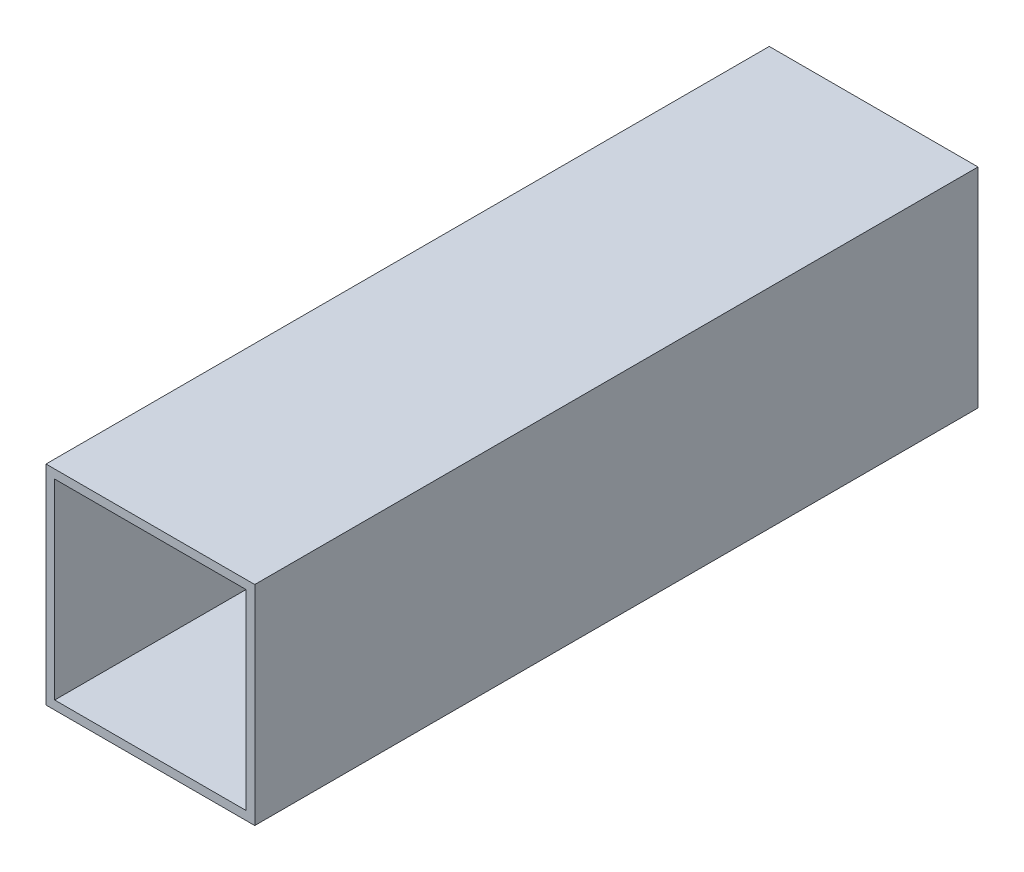
ISO-10303-21;
HEADER;
FILE_DESCRIPTION(('STEP AP214'),'2;1');
FILE_NAME('part.step','',(''),(''),'','','');
FILE_SCHEMA(('AUTOMOTIVE_DESIGN { 1 0 10303 214 1 1 1 1 }'));
ENDSEC;
DATA;
#1=APPLICATION_CONTEXT('core data for automotive mechanical design processes');
#2=APPLICATION_PROTOCOL_DEFINITION('international standard','automotive_design',2000,#1);
#3=PRODUCT_CONTEXT('',#1,'mechanical');
#4=PRODUCT('Part','Part','',(#3));
#5=PRODUCT_RELATED_PRODUCT_CATEGORY('part','',(#4));
#6=PRODUCT_DEFINITION_FORMATION('','',#4);
#7=PRODUCT_DEFINITION_CONTEXT('part definition',#1,'design');
#8=PRODUCT_DEFINITION('design','',#6,#7);
#9=PRODUCT_DEFINITION_SHAPE('','',#8);
#10=(LENGTH_UNIT() NAMED_UNIT(*) SI_UNIT(.MILLI.,.METRE.));
#11=(NAMED_UNIT(*) PLANE_ANGLE_UNIT() SI_UNIT($,.RADIAN.));
#12=(NAMED_UNIT(*) SI_UNIT($,.STERADIAN.) SOLID_ANGLE_UNIT());
#13=UNCERTAINTY_MEASURE_WITH_UNIT(LENGTH_MEASURE(1.E-05),#10,'distance_accuracy_value','');
#14=(GEOMETRIC_REPRESENTATION_CONTEXT(3) GLOBAL_UNCERTAINTY_ASSIGNED_CONTEXT((#13)) GLOBAL_UNIT_ASSIGNED_CONTEXT((#10,
#11,#12)) REPRESENTATION_CONTEXT('',''));
#15=CARTESIAN_POINT('',(0.,0.,0.));
#16=DIRECTION('',(0.,0.,1.));
#17=DIRECTION('',(1.,0.,0.));
#18=AXIS2_PLACEMENT_3D('',#15,#16,#17);
#19=CARTESIAN_POINT('',(38.1,-38.1,132.));
#20=DIRECTION('',(-1.,0.,0.));
#21=DIRECTION('',(0.,-1.,0.));
#22=AXIS2_PLACEMENT_3D('',#19,#20,#21);
#23=PLANE('',#22);
#24=DIRECTION('',(0.,1.,0.));
#25=VECTOR('',#24,1.);
#26=CARTESIAN_POINT('',(38.1,-38.1,-132.));
#27=LINE('',#26,#25);
#28=CARTESIAN_POINT('',(38.1,-38.1,-132.));
#29=VERTEX_POINT('',#28);
#30=CARTESIAN_POINT('',(38.1,38.1,-132.));
#31=VERTEX_POINT('',#30);
#32=EDGE_CURVE('E134',#29,#31,#27,.T.);
#33=ORIENTED_EDGE('',*,*,#32,.T.);
#34=DIRECTION('',(0.,0.,-1.));
#35=VECTOR('',#34,1.);
#36=CARTESIAN_POINT('',(38.1,38.1,132.));
#37=LINE('',#36,#35);
#38=CARTESIAN_POINT('',(38.1,38.1,132.));
#39=VERTEX_POINT('',#38);
#40=EDGE_CURVE('E12',#39,#31,#37,.T.);
#41=ORIENTED_EDGE('',*,*,#40,.F.);
#42=DIRECTION('',(0.,1.,0.));
#43=VECTOR('',#42,1.);
#44=CARTESIAN_POINT('',(38.1,-38.1,132.));
#45=LINE('',#44,#43);
#46=CARTESIAN_POINT('',(38.1,-38.1,132.));
#47=VERTEX_POINT('',#46);
#48=EDGE_CURVE('E161',#47,#39,#45,.T.);
#49=ORIENTED_EDGE('',*,*,#48,.F.);
#50=DIRECTION('',(0.,0.,-1.));
#51=VECTOR('',#50,1.);
#52=CARTESIAN_POINT('',(38.1,-38.1,132.));
#53=LINE('',#52,#51);
#54=EDGE_CURVE('E176',#47,#29,#53,.T.);
#55=ORIENTED_EDGE('',*,*,#54,.T.);
#56=EDGE_LOOP('',(#33,#41,#49,#55));
#57=FACE_BOUND('',#56,.T.);
#58=ADVANCED_FACE('F65',(#57),#23,.F.);
#59=CARTESIAN_POINT('',(38.1,38.1,132.));
#60=DIRECTION('',(0.,-1.,0.));
#61=DIRECTION('',(1.,0.,0.));
#62=AXIS2_PLACEMENT_3D('',#59,#60,#61);
#63=PLANE('',#62);
#64=DIRECTION('',(-1.,0.,0.));
#65=VECTOR('',#64,1.);
#66=CARTESIAN_POINT('',(38.1,38.1,-132.));
#67=LINE('',#66,#65);
#68=CARTESIAN_POINT('',(-38.1,38.1,-132.));
#69=VERTEX_POINT('',#68);
#70=EDGE_CURVE('E177',#31,#69,#67,.T.);
#71=ORIENTED_EDGE('',*,*,#70,.T.);
#72=DIRECTION('',(0.,0.,-1.));
#73=VECTOR('',#72,1.);
#74=CARTESIAN_POINT('',(-38.1,38.1,132.));
#75=LINE('',#74,#73);
#76=CARTESIAN_POINT('',(-38.1,38.1,132.));
#77=VERTEX_POINT('',#76);
#78=EDGE_CURVE('E68',#77,#69,#75,.T.);
#79=ORIENTED_EDGE('',*,*,#78,.F.);
#80=DIRECTION('',(-1.,0.,0.));
#81=VECTOR('',#80,1.);
#82=CARTESIAN_POINT('',(38.1,38.1,132.));
#83=LINE('',#82,#81);
#84=EDGE_CURVE('E167',#39,#77,#83,.T.);
#85=ORIENTED_EDGE('',*,*,#84,.F.);
#86=ORIENTED_EDGE('',*,*,#40,.T.);
#87=EDGE_LOOP('',(#71,#79,#85,#86));
#88=FACE_BOUND('',#87,.T.);
#89=ADVANCED_FACE('F193',(#88),#63,.F.);
#90=CARTESIAN_POINT('',(-38.1,-38.1,132.));
#91=DIRECTION('',(-1.,0.,0.));
#92=DIRECTION('',(0.,-1.,0.));
#93=AXIS2_PLACEMENT_3D('',#90,#91,#92);
#94=PLANE('',#93);
#95=DIRECTION('',(0.,1.,0.));
#96=VECTOR('',#95,1.);
#97=CARTESIAN_POINT('',(-38.1,-38.1,-132.));
#98=LINE('',#97,#96);
#99=CARTESIAN_POINT('',(-38.1,-38.1,-132.));
#100=VERTEX_POINT('',#99);
#101=EDGE_CURVE('E185',#100,#69,#98,.T.);
#102=ORIENTED_EDGE('',*,*,#101,.F.);
#103=DIRECTION('',(0.,0.,-1.));
#104=VECTOR('',#103,1.);
#105=CARTESIAN_POINT('',(-38.1,-38.1,132.));
#106=LINE('',#105,#104);
#107=CARTESIAN_POINT('',(-38.1,-38.1,132.));
#108=VERTEX_POINT('',#107);
#109=EDGE_CURVE('E187',#108,#100,#106,.T.);
#110=ORIENTED_EDGE('',*,*,#109,.F.);
#111=DIRECTION('',(0.,1.,0.));
#112=VECTOR('',#111,1.);
#113=CARTESIAN_POINT('',(-38.1,-38.1,132.));
#114=LINE('',#113,#112);
#115=EDGE_CURVE('E169',#108,#77,#114,.T.);
#116=ORIENTED_EDGE('',*,*,#115,.T.);
#117=ORIENTED_EDGE('',*,*,#78,.T.);
#118=EDGE_LOOP('',(#102,#110,#116,#117));
#119=FACE_BOUND('',#118,.T.);
#120=ADVANCED_FACE('F195',(#119),#94,.T.);
#121=CARTESIAN_POINT('',(38.1,-38.1,132.));
#122=DIRECTION('',(0.,-1.,0.));
#123=DIRECTION('',(0.,0.,-1.));
#124=AXIS2_PLACEMENT_3D('',#121,#122,#123);
#125=PLANE('',#124);
#126=DIRECTION('',(-1.,0.,0.));
#127=VECTOR('',#126,1.);
#128=CARTESIAN_POINT('',(38.1,-38.1,-132.));
#129=LINE('',#128,#127);
#130=EDGE_CURVE('E166',#29,#100,#129,.T.);
#131=ORIENTED_EDGE('',*,*,#130,.F.);
#132=ORIENTED_EDGE('',*,*,#54,.F.);
#133=DIRECTION('',(-1.,0.,0.));
#134=VECTOR('',#133,1.);
#135=CARTESIAN_POINT('',(38.1,-38.1,132.));
#136=LINE('',#135,#134);
#137=EDGE_CURVE('E171',#47,#108,#136,.T.);
#138=ORIENTED_EDGE('',*,*,#137,.T.);
#139=ORIENTED_EDGE('',*,*,#109,.T.);
#140=EDGE_LOOP('',(#131,#132,#138,#139));
#141=FACE_BOUND('',#140,.T.);
#142=ADVANCED_FACE('F205',(#141),#125,.T.);
#143=CARTESIAN_POINT('',(0.,0.,132.));
#144=DIRECTION('',(0.,0.,1.));
#145=DIRECTION('',(1.,0.,0.));
#146=AXIS2_PLACEMENT_3D('',#143,#144,#145);
#147=PLANE('',#146);
#148=DIRECTION('',(-1.,0.,0.));
#149=VECTOR('',#148,1.);
#150=CARTESIAN_POINT('',(0.,-34.925,132.));
#151=LINE('',#150,#149);
#152=CARTESIAN_POINT('',(34.925,-34.925,132.));
#153=VERTEX_POINT('',#152);
#154=CARTESIAN_POINT('',(-34.925,-34.925,132.));
#155=VERTEX_POINT('',#154);
#156=EDGE_CURVE('E137',#153,#155,#151,.T.);
#157=ORIENTED_EDGE('',*,*,#156,.T.);
#158=DIRECTION('',(0.,1.,0.));
#159=VECTOR('',#158,1.);
#160=CARTESIAN_POINT('',(-34.925,0.,132.));
#161=LINE('',#160,#159);
#162=CARTESIAN_POINT('',(-34.925,34.925,132.));
#163=VERTEX_POINT('',#162);
#164=EDGE_CURVE('E152',#155,#163,#161,.T.);
#165=ORIENTED_EDGE('',*,*,#164,.T.);
#166=DIRECTION('',(-1.,0.,0.));
#167=VECTOR('',#166,1.);
#168=CARTESIAN_POINT('',(0.,34.925,132.));
#169=LINE('',#168,#167);
#170=CARTESIAN_POINT('',(34.925,34.925,132.));
#171=VERTEX_POINT('',#170);
#172=EDGE_CURVE('E146',#171,#163,#169,.T.);
#173=ORIENTED_EDGE('',*,*,#172,.F.);
#174=DIRECTION('',(0.,1.,0.));
#175=VECTOR('',#174,1.);
#176=CARTESIAN_POINT('',(34.925,0.,132.));
#177=LINE('',#176,#175);
#178=EDGE_CURVE('E131',#153,#171,#177,.T.);
#179=ORIENTED_EDGE('',*,*,#178,.F.);
#180=EDGE_LOOP('',(#157,#165,#173,#179));
#181=FACE_BOUND('',#180,.T.);
#182=ORIENTED_EDGE('',*,*,#48,.T.);
#183=ORIENTED_EDGE('',*,*,#84,.T.);
#184=ORIENTED_EDGE('',*,*,#115,.F.);
#185=ORIENTED_EDGE('',*,*,#137,.F.);
#186=EDGE_LOOP('',(#182,#183,#184,#185));
#187=FACE_BOUND('',#186,.T.);
#188=ADVANCED_FACE('F150',(#181,#187),#147,.T.);
#189=CARTESIAN_POINT('',(0.,0.,-132.));
#190=DIRECTION('',(0.,0.,1.));
#191=DIRECTION('',(1.,0.,0.));
#192=AXIS2_PLACEMENT_3D('',#189,#190,#191);
#193=PLANE('',#192);
#194=DIRECTION('',(0.,1.,0.));
#195=VECTOR('',#194,1.);
#196=CARTESIAN_POINT('',(-34.925,0.,-132.));
#197=LINE('',#196,#195);
#198=CARTESIAN_POINT('',(-34.925,-34.925,-132.));
#199=VERTEX_POINT('',#198);
#200=CARTESIAN_POINT('',(-34.925,34.925,-132.));
#201=VERTEX_POINT('',#200);
#202=EDGE_CURVE('E143',#199,#201,#197,.T.);
#203=ORIENTED_EDGE('',*,*,#202,.F.);
#204=DIRECTION('',(-1.,0.,0.));
#205=VECTOR('',#204,1.);
#206=CARTESIAN_POINT('',(0.,-34.925,-132.));
#207=LINE('',#206,#205);
#208=CARTESIAN_POINT('',(34.925,-34.925,-132.));
#209=VERTEX_POINT('',#208);
#210=EDGE_CURVE('E82',#209,#199,#207,.T.);
#211=ORIENTED_EDGE('',*,*,#210,.F.);
#212=DIRECTION('',(0.,1.,0.));
#213=VECTOR('',#212,1.);
#214=CARTESIAN_POINT('',(34.925,0.,-132.));
#215=LINE('',#214,#213);
#216=CARTESIAN_POINT('',(34.925,34.925,-132.));
#217=VERTEX_POINT('',#216);
#218=EDGE_CURVE('E132',#209,#217,#215,.T.);
#219=ORIENTED_EDGE('',*,*,#218,.T.);
#220=DIRECTION('',(-1.,0.,0.));
#221=VECTOR('',#220,1.);
#222=CARTESIAN_POINT('',(0.,34.925,-132.));
#223=LINE('',#222,#221);
#224=EDGE_CURVE('E160',#217,#201,#223,.T.);
#225=ORIENTED_EDGE('',*,*,#224,.T.);
#226=EDGE_LOOP('',(#203,#211,#219,#225));
#227=FACE_BOUND('',#226,.T.);
#228=ORIENTED_EDGE('',*,*,#32,.F.);
#229=ORIENTED_EDGE('',*,*,#130,.T.);
#230=ORIENTED_EDGE('',*,*,#101,.T.);
#231=ORIENTED_EDGE('',*,*,#70,.F.);
#232=EDGE_LOOP('',(#228,#229,#230,#231));
#233=FACE_BOUND('',#232,.T.);
#234=ADVANCED_FACE('F196',(#227,#233),#193,.F.);
#235=CARTESIAN_POINT('',(0.,-34.925,132.));
#236=DIRECTION('',(0.,-1.,0.));
#237=DIRECTION('',(0.,0.,-1.));
#238=AXIS2_PLACEMENT_3D('',#235,#236,#237);
#239=PLANE('',#238);
#240=ORIENTED_EDGE('',*,*,#210,.T.);
#241=DIRECTION('',(0.,0.,-1.));
#242=VECTOR('',#241,1.);
#243=CARTESIAN_POINT('',(-34.925,-34.925,132.));
#244=LINE('',#243,#242);
#245=EDGE_CURVE('E141',#155,#199,#244,.T.);
#246=ORIENTED_EDGE('',*,*,#245,.F.);
#247=ORIENTED_EDGE('',*,*,#156,.F.);
#248=DIRECTION('',(0.,0.,-1.));
#249=VECTOR('',#248,1.);
#250=CARTESIAN_POINT('',(34.925,-34.925,132.));
#251=LINE('',#250,#249);
#252=EDGE_CURVE('E130',#153,#209,#251,.T.);
#253=ORIENTED_EDGE('',*,*,#252,.T.);
#254=EDGE_LOOP('',(#240,#246,#247,#253));
#255=FACE_BOUND('',#254,.T.);
#256=ADVANCED_FACE('F139',(#255),#239,.F.);
#257=CARTESIAN_POINT('',(34.925,0.,132.));
#258=DIRECTION('',(-1.,0.,0.));
#259=DIRECTION('',(0.,0.,1.));
#260=AXIS2_PLACEMENT_3D('',#257,#258,#259);
#261=PLANE('',#260);
#262=ORIENTED_EDGE('',*,*,#218,.F.);
#263=ORIENTED_EDGE('',*,*,#252,.F.);
#264=ORIENTED_EDGE('',*,*,#178,.T.);
#265=DIRECTION('',(0.,0.,-1.));
#266=VECTOR('',#265,1.);
#267=CARTESIAN_POINT('',(34.925,34.925,132.));
#268=LINE('',#267,#266);
#269=EDGE_CURVE('E136',#171,#217,#268,.T.);
#270=ORIENTED_EDGE('',*,*,#269,.T.);
#271=EDGE_LOOP('',(#262,#263,#264,#270));
#272=FACE_BOUND('',#271,.T.);
#273=ADVANCED_FACE('F129',(#272),#261,.T.);
#274=CARTESIAN_POINT('',(0.,34.925,132.));
#275=DIRECTION('',(0.,-1.,0.));
#276=DIRECTION('',(0.,0.,-1.));
#277=AXIS2_PLACEMENT_3D('',#274,#275,#276);
#278=PLANE('',#277);
#279=ORIENTED_EDGE('',*,*,#224,.F.);
#280=ORIENTED_EDGE('',*,*,#269,.F.);
#281=ORIENTED_EDGE('',*,*,#172,.T.);
#282=DIRECTION('',(0.,0.,-1.));
#283=VECTOR('',#282,1.);
#284=CARTESIAN_POINT('',(-34.925,34.925,132.));
#285=LINE('',#284,#283);
#286=EDGE_CURVE('E77',#163,#201,#285,.T.);
#287=ORIENTED_EDGE('',*,*,#286,.T.);
#288=EDGE_LOOP('',(#279,#280,#281,#287));
#289=FACE_BOUND('',#288,.T.);
#290=ADVANCED_FACE('F226',(#289),#278,.T.);
#291=CARTESIAN_POINT('',(-34.925,0.,132.));
#292=DIRECTION('',(-1.,0.,0.));
#293=DIRECTION('',(0.,0.,1.));
#294=AXIS2_PLACEMENT_3D('',#291,#292,#293);
#295=PLANE('',#294);
#296=ORIENTED_EDGE('',*,*,#202,.T.);
#297=ORIENTED_EDGE('',*,*,#286,.F.);
#298=ORIENTED_EDGE('',*,*,#164,.F.);
#299=ORIENTED_EDGE('',*,*,#245,.T.);
#300=EDGE_LOOP('',(#296,#297,#298,#299));
#301=FACE_BOUND('',#300,.T.);
#302=ADVANCED_FACE('F227',(#301),#295,.F.);
#303=CLOSED_SHELL('',(#58,#89,#120,#142,#188,#234,#256,#273,#290,#302));
#304=MANIFOLD_SOLID_BREP('B2',#303);
#305=ADVANCED_BREP_SHAPE_REPRESENTATION('',(#18,#304),#14);
#306=SHAPE_DEFINITION_REPRESENTATION(#9,#305);
ENDSEC;
END-ISO-10303-21;
